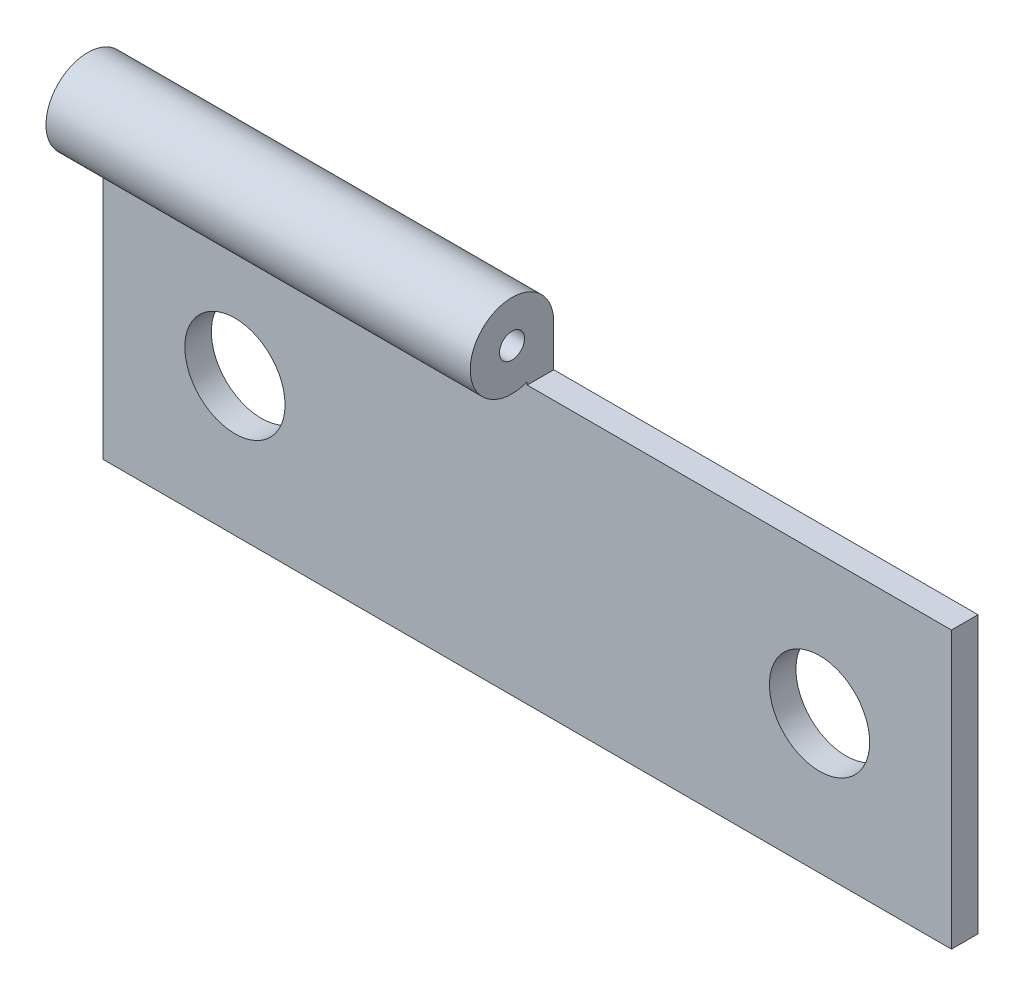
ISO-10303-21;
HEADER;
FILE_DESCRIPTION(('STEP AP214'),'2;1');
FILE_NAME('part.step','',(''),(''),'','','');
FILE_SCHEMA(('AUTOMOTIVE_DESIGN { 1 0 10303 214 1 1 1 1 }'));
ENDSEC;
DATA;
#1=APPLICATION_CONTEXT('core data for automotive mechanical design processes');
#2=APPLICATION_PROTOCOL_DEFINITION('international standard','automotive_design',2000,#1);
#3=PRODUCT_CONTEXT('',#1,'mechanical');
#4=PRODUCT('Part','Part','',(#3));
#5=PRODUCT_RELATED_PRODUCT_CATEGORY('part','',(#4));
#6=PRODUCT_DEFINITION_FORMATION('','',#4);
#7=PRODUCT_DEFINITION_CONTEXT('part definition',#1,'design');
#8=PRODUCT_DEFINITION('design','',#6,#7);
#9=PRODUCT_DEFINITION_SHAPE('','',#8);
#10=(LENGTH_UNIT() NAMED_UNIT(*) SI_UNIT(.MILLI.,.METRE.));
#11=(NAMED_UNIT(*) PLANE_ANGLE_UNIT() SI_UNIT($,.RADIAN.));
#12=(NAMED_UNIT(*) SI_UNIT($,.STERADIAN.) SOLID_ANGLE_UNIT());
#13=UNCERTAINTY_MEASURE_WITH_UNIT(LENGTH_MEASURE(1.E-05),#10,'distance_accuracy_value','');
#14=(GEOMETRIC_REPRESENTATION_CONTEXT(3) GLOBAL_UNCERTAINTY_ASSIGNED_CONTEXT((#13)) GLOBAL_UNIT_ASSIGNED_CONTEXT((#10,
#11,#12)) REPRESENTATION_CONTEXT('',''));
#15=CARTESIAN_POINT('',(0.,0.,0.));
#16=DIRECTION('',(0.,0.,1.));
#17=DIRECTION('',(1.,0.,0.));
#18=AXIS2_PLACEMENT_3D('',#15,#16,#17);
#19=CARTESIAN_POINT('',(0.,0.,1.5875));
#20=DIRECTION('',(0.,0.,1.));
#21=DIRECTION('',(1.,0.,0.));
#22=AXIS2_PLACEMENT_3D('',#19,#20,#21);
#23=PLANE('',#22);
#24=CARTESIAN_POINT('',(-17.5,8.275,1.5875));
#25=DIRECTION('',(0.,0.,1.));
#26=DIRECTION('',(1.,0.,0.));
#27=AXIS2_PLACEMENT_3D('',#24,#25,#26);
#28=CIRCLE('',#27,3.);
#29=CARTESIAN_POINT('',(-14.5,8.275,1.5875));
#30=VERTEX_POINT('',#29);
#31=EDGE_CURVE('E257',#30,#30,#28,.T.);
#32=ORIENTED_EDGE('',*,*,#31,.F.);
#33=EDGE_LOOP('',(#32));
#34=FACE_BOUND('',#33,.T.);
#35=CARTESIAN_POINT('',(17.5,8.275,1.5875));
#36=DIRECTION('',(0.,0.,1.));
#37=DIRECTION('',(1.,0.,0.));
#38=AXIS2_PLACEMENT_3D('',#35,#36,#37);
#39=CIRCLE('',#38,3.);
#40=CARTESIAN_POINT('',(20.5,8.275,1.5875));
#41=VERTEX_POINT('',#40);
#42=EDGE_CURVE('E261',#41,#41,#39,.T.);
#43=ORIENTED_EDGE('',*,*,#42,.F.);
#44=EDGE_LOOP('',(#43));
#45=FACE_BOUND('',#44,.T.);
#46=DIRECTION('',(-1.,0.,0.));
#47=VECTOR('',#46,1.);
#48=CARTESIAN_POINT('',(0.,16.55,1.5875));
#49=LINE('',#48,#47);
#50=CARTESIAN_POINT('',(25.4,16.55,1.5875));
#51=VERTEX_POINT('',#50);
#52=CARTESIAN_POINT('',(0.,16.55,1.5875));
#53=VERTEX_POINT('',#52);
#54=EDGE_CURVE('E111',#51,#53,#49,.T.);
#55=ORIENTED_EDGE('',*,*,#54,.T.);
#56=DIRECTION('',(0.,1.,0.));
#57=VECTOR('',#56,1.);
#58=CARTESIAN_POINT('',(0.,0.,1.5875));
#59=LINE('',#58,#57);
#60=CARTESIAN_POINT('',(0.,16.7224812030834,1.5875));
#61=VERTEX_POINT('',#60);
#62=EDGE_CURVE('E94',#53,#61,#59,.T.);
#63=ORIENTED_EDGE('',*,*,#62,.T.);
#64=DIRECTION('',(-1.,0.,0.));
#65=VECTOR('',#64,1.);
#66=CARTESIAN_POINT('',(0.,16.7224812030834,1.5875));
#67=LINE('',#66,#65);
#68=CARTESIAN_POINT('',(-25.4,16.7224812030834,1.5875));
#69=VERTEX_POINT('',#68);
#70=EDGE_CURVE('E56',#69,#61,#67,.F.);
#71=ORIENTED_EDGE('',*,*,#70,.F.);
#72=DIRECTION('',(0.,-1.,0.));
#73=VECTOR('',#72,1.);
#74=CARTESIAN_POINT('',(-25.4,0.,1.5875));
#75=LINE('',#74,#73);
#76=CARTESIAN_POINT('',(-25.4,0.,1.5875));
#77=VERTEX_POINT('',#76);
#78=EDGE_CURVE('E126',#69,#77,#75,.T.);
#79=ORIENTED_EDGE('',*,*,#78,.T.);
#80=DIRECTION('',(1.,0.,0.));
#81=VECTOR('',#80,1.);
#82=CARTESIAN_POINT('',(-25.4,0.,1.5875));
#83=LINE('',#82,#81);
#84=CARTESIAN_POINT('',(25.4,0.,1.5875));
#85=VERTEX_POINT('',#84);
#86=EDGE_CURVE('E128',#77,#85,#83,.T.);
#87=ORIENTED_EDGE('',*,*,#86,.T.);
#88=DIRECTION('',(0.,1.,0.));
#89=VECTOR('',#88,1.);
#90=CARTESIAN_POINT('',(25.4,0.,1.5875));
#91=LINE('',#90,#89);
#92=EDGE_CURVE('E130',#85,#51,#91,.T.);
#93=ORIENTED_EDGE('',*,*,#92,.T.);
#94=EDGE_LOOP('',(#55,#63,#71,#79,#87,#93));
#95=FACE_BOUND('',#94,.T.);
#96=ADVANCED_FACE('F33',(#34,#45,#95),#23,.T.);
#97=CARTESIAN_POINT('',(0.,0.,0.));
#98=DIRECTION('',(0.,0.,1.));
#99=DIRECTION('',(1.,0.,0.));
#100=AXIS2_PLACEMENT_3D('',#97,#98,#99);
#101=PLANE('',#100);
#102=CARTESIAN_POINT('',(-17.5,8.275,0.));
#103=DIRECTION('',(0.,0.,1.));
#104=DIRECTION('',(1.,0.,0.));
#105=AXIS2_PLACEMENT_3D('',#102,#103,#104);
#106=CIRCLE('',#105,2.99999999999999);
#107=CARTESIAN_POINT('',(-14.5,8.275,0.));
#108=VERTEX_POINT('',#107);
#109=EDGE_CURVE('E260',#108,#108,#106,.T.);
#110=ORIENTED_EDGE('',*,*,#109,.T.);
#111=EDGE_LOOP('',(#110));
#112=FACE_BOUND('',#111,.T.);
#113=CARTESIAN_POINT('',(17.5,8.275,0.));
#114=DIRECTION('',(0.,0.,1.));
#115=DIRECTION('',(1.,0.,0.));
#116=AXIS2_PLACEMENT_3D('',#113,#114,#115);
#117=CIRCLE('',#116,2.99999999999999);
#118=CARTESIAN_POINT('',(20.5,8.275,0.));
#119=VERTEX_POINT('',#118);
#120=EDGE_CURVE('E96',#119,#119,#117,.T.);
#121=ORIENTED_EDGE('',*,*,#120,.T.);
#122=EDGE_LOOP('',(#121));
#123=FACE_BOUND('',#122,.T.);
#124=DIRECTION('',(0.,1.,0.));
#125=VECTOR('',#124,1.);
#126=CARTESIAN_POINT('',(0.,16.55,0.));
#127=LINE('',#126,#125);
#128=CARTESIAN_POINT('',(0.,16.55,0.));
#129=VERTEX_POINT('',#128);
#130=CARTESIAN_POINT('',(0.,19.05,0.));
#131=VERTEX_POINT('',#130);
#132=EDGE_CURVE('E92',#129,#131,#127,.T.);
#133=ORIENTED_EDGE('',*,*,#132,.F.);
#134=DIRECTION('',(-1.,0.,0.));
#135=VECTOR('',#134,1.);
#136=CARTESIAN_POINT('',(32.4710678118655,16.55,0.));
#137=LINE('',#136,#135);
#138=CARTESIAN_POINT('',(25.4,16.55,0.));
#139=VERTEX_POINT('',#138);
#140=EDGE_CURVE('E98',#139,#129,#137,.T.);
#141=ORIENTED_EDGE('',*,*,#140,.F.);
#142=DIRECTION('',(0.,1.,0.));
#143=VECTOR('',#142,1.);
#144=CARTESIAN_POINT('',(25.4,0.,0.));
#145=LINE('',#144,#143);
#146=CARTESIAN_POINT('',(25.4,0.,0.));
#147=VERTEX_POINT('',#146);
#148=EDGE_CURVE('E137',#147,#139,#145,.T.);
#149=ORIENTED_EDGE('',*,*,#148,.F.);
#150=DIRECTION('',(1.,0.,0.));
#151=VECTOR('',#150,1.);
#152=CARTESIAN_POINT('',(-25.4,0.,0.));
#153=LINE('',#152,#151);
#154=CARTESIAN_POINT('',(-25.4,0.,0.));
#155=VERTEX_POINT('',#154);
#156=EDGE_CURVE('E135',#155,#147,#153,.T.);
#157=ORIENTED_EDGE('',*,*,#156,.F.);
#158=DIRECTION('',(0.,-1.,0.));
#159=VECTOR('',#158,1.);
#160=CARTESIAN_POINT('',(-25.4,0.,0.));
#161=LINE('',#160,#159);
#162=CARTESIAN_POINT('',(-25.4,19.05,0.));
#163=VERTEX_POINT('',#162);
#164=EDGE_CURVE('E125',#163,#155,#161,.T.);
#165=ORIENTED_EDGE('',*,*,#164,.F.);
#166=DIRECTION('',(-1.,0.,0.));
#167=VECTOR('',#166,1.);
#168=CARTESIAN_POINT('',(25.4,19.05,0.));
#169=LINE('',#168,#167);
#170=EDGE_CURVE('E106',#131,#163,#169,.T.);
#171=ORIENTED_EDGE('',*,*,#170,.F.);
#172=EDGE_LOOP('',(#133,#141,#149,#157,#165,#171));
#173=FACE_BOUND('',#172,.T.);
#174=ADVANCED_FACE('F104',(#112,#123,#173),#101,.F.);
#175=CARTESIAN_POINT('',(-25.4,0.,1.5875));
#176=DIRECTION('',(1.,0.,0.));
#177=DIRECTION('',(0.,0.,-1.));
#178=AXIS2_PLACEMENT_3D('',#175,#176,#177);
#179=PLANE('',#178);
#180=ORIENTED_EDGE('',*,*,#78,.F.);
#181=CARTESIAN_POINT('',(-25.4,19.05,2.5));
#182=DIRECTION('',(-1.,0.,0.));
#183=DIRECTION('',(0.,0.,1.));
#184=AXIS2_PLACEMENT_3D('',#181,#182,#183);
#185=CIRCLE('',#184,2.5);
#186=EDGE_CURVE('E117',#69,#163,#185,.T.);
#187=ORIENTED_EDGE('',*,*,#186,.T.);
#188=ORIENTED_EDGE('',*,*,#164,.T.);
#189=DIRECTION('',(0.,0.,-1.));
#190=VECTOR('',#189,1.);
#191=CARTESIAN_POINT('',(-25.4,0.,1.5875));
#192=LINE('',#191,#190);
#193=EDGE_CURVE('E11',#77,#155,#192,.T.);
#194=ORIENTED_EDGE('',*,*,#193,.F.);
#195=EDGE_LOOP('',(#180,#187,#188,#194));
#196=FACE_BOUND('',#195,.T.);
#197=CARTESIAN_POINT('',(-25.4,19.05,2.5));
#198=DIRECTION('',(-1.,0.,0.));
#199=DIRECTION('',(0.,0.,1.));
#200=AXIS2_PLACEMENT_3D('',#197,#198,#199);
#201=CIRCLE('',#200,0.750000000000003);
#202=CARTESIAN_POINT('',(-25.4,19.05,3.25));
#203=VERTEX_POINT('',#202);
#204=EDGE_CURVE('E113',#203,#203,#201,.T.);
#205=ORIENTED_EDGE('',*,*,#204,.F.);
#206=EDGE_LOOP('',(#205));
#207=FACE_BOUND('',#206,.T.);
#208=ADVANCED_FACE('F35',(#196,#207),#179,.F.);
#209=CARTESIAN_POINT('',(-25.4,0.,1.5875));
#210=DIRECTION('',(0.,1.,0.));
#211=DIRECTION('',(-1.,0.,0.));
#212=AXIS2_PLACEMENT_3D('',#209,#210,#211);
#213=PLANE('',#212);
#214=ORIENTED_EDGE('',*,*,#156,.T.);
#215=DIRECTION('',(0.,0.,-1.));
#216=VECTOR('',#215,1.);
#217=CARTESIAN_POINT('',(25.4,0.,1.5875));
#218=LINE('',#217,#216);
#219=EDGE_CURVE('E41',#85,#147,#218,.T.);
#220=ORIENTED_EDGE('',*,*,#219,.F.);
#221=ORIENTED_EDGE('',*,*,#86,.F.);
#222=ORIENTED_EDGE('',*,*,#193,.T.);
#223=EDGE_LOOP('',(#214,#220,#221,#222));
#224=FACE_BOUND('',#223,.T.);
#225=ADVANCED_FACE('F147',(#224),#213,.F.);
#226=CARTESIAN_POINT('',(25.4,0.,1.5875));
#227=DIRECTION('',(-1.,0.,0.));
#228=DIRECTION('',(0.,0.,1.));
#229=AXIS2_PLACEMENT_3D('',#226,#227,#228);
#230=PLANE('',#229);
#231=DIRECTION('',(0.,0.,1.));
#232=VECTOR('',#231,1.);
#233=CARTESIAN_POINT('',(25.4,16.55,2.5));
#234=LINE('',#233,#232);
#235=EDGE_CURVE('E48',#139,#51,#234,.T.);
#236=ORIENTED_EDGE('',*,*,#235,.T.);
#237=ORIENTED_EDGE('',*,*,#92,.F.);
#238=ORIENTED_EDGE('',*,*,#219,.T.);
#239=ORIENTED_EDGE('',*,*,#148,.T.);
#240=EDGE_LOOP('',(#236,#237,#238,#239));
#241=FACE_BOUND('',#240,.T.);
#242=ADVANCED_FACE('F143',(#241),#230,.F.);
#243=CARTESIAN_POINT('',(0.,19.05,2.5));
#244=DIRECTION('',(-1.,0.,0.));
#245=DIRECTION('',(0.,0.,1.));
#246=AXIS2_PLACEMENT_3D('',#243,#244,#245);
#247=PLANE('',#246);
#248=ORIENTED_EDGE('',*,*,#132,.T.);
#249=CARTESIAN_POINT('',(0.,19.05,2.5));
#250=DIRECTION('',(-1.,0.,0.));
#251=DIRECTION('',(0.,0.,1.));
#252=AXIS2_PLACEMENT_3D('',#249,#250,#251);
#253=CIRCLE('',#252,2.5);
#254=EDGE_CURVE('E120',#61,#131,#253,.T.);
#255=ORIENTED_EDGE('',*,*,#254,.F.);
#256=ORIENTED_EDGE('',*,*,#62,.F.);
#257=DIRECTION('',(0.,0.,-1.));
#258=VECTOR('',#257,1.);
#259=CARTESIAN_POINT('',(0.,16.55,2.5));
#260=LINE('',#259,#258);
#261=EDGE_CURVE('E87',#53,#129,#260,.T.);
#262=ORIENTED_EDGE('',*,*,#261,.T.);
#263=EDGE_LOOP('',(#248,#255,#256,#262));
#264=FACE_BOUND('',#263,.T.);
#265=CARTESIAN_POINT('',(0.,19.05,2.5));
#266=DIRECTION('',(-1.,0.,0.));
#267=DIRECTION('',(0.,0.,1.));
#268=AXIS2_PLACEMENT_3D('',#265,#266,#267);
#269=CIRCLE('',#268,0.750000000000003);
#270=CARTESIAN_POINT('',(0.,19.05,3.25));
#271=VERTEX_POINT('',#270);
#272=EDGE_CURVE('E114',#271,#271,#269,.T.);
#273=ORIENTED_EDGE('',*,*,#272,.T.);
#274=EDGE_LOOP('',(#273));
#275=FACE_BOUND('',#274,.T.);
#276=ADVANCED_FACE('F88',(#264,#275),#247,.F.);
#277=CARTESIAN_POINT('',(0.,19.05,2.5));
#278=DIRECTION('',(-1.,0.,0.));
#279=DIRECTION('',(0.,0.,1.));
#280=AXIS2_PLACEMENT_3D('',#277,#278,#279);
#281=CYLINDRICAL_SURFACE('',#280,2.5);
#282=ORIENTED_EDGE('',*,*,#186,.F.);
#283=ORIENTED_EDGE('',*,*,#70,.T.);
#284=ORIENTED_EDGE('',*,*,#254,.T.);
#285=ORIENTED_EDGE('',*,*,#170,.T.);
#286=EDGE_LOOP('',(#282,#283,#284,#285));
#287=FACE_BOUND('',#286,.T.);
#288=ADVANCED_FACE('F152',(#287),#281,.T.);
#289=CARTESIAN_POINT('',(0.,19.05,2.5));
#290=DIRECTION('',(-1.,0.,0.));
#291=DIRECTION('',(0.,0.,1.));
#292=AXIS2_PLACEMENT_3D('',#289,#290,#291);
#293=CYLINDRICAL_SURFACE('',#292,0.750000000000003);
#294=ORIENTED_EDGE('',*,*,#272,.F.);
#295=EDGE_LOOP('',(#294));
#296=FACE_BOUND('',#295,.T.);
#297=ORIENTED_EDGE('',*,*,#204,.T.);
#298=EDGE_LOOP('',(#297));
#299=FACE_BOUND('',#298,.T.);
#300=ADVANCED_FACE('F154',(#296,#299),#293,.F.);
#301=CARTESIAN_POINT('',(32.4710678118655,16.55,2.5));
#302=DIRECTION('',(0.,1.,0.));
#303=DIRECTION('',(0.,0.,1.));
#304=AXIS2_PLACEMENT_3D('',#301,#302,#303);
#305=PLANE('',#304);
#306=ORIENTED_EDGE('',*,*,#235,.F.);
#307=ORIENTED_EDGE('',*,*,#140,.T.);
#308=ORIENTED_EDGE('',*,*,#261,.F.);
#309=ORIENTED_EDGE('',*,*,#54,.F.);
#310=EDGE_LOOP('',(#306,#307,#308,#309));
#311=FACE_BOUND('',#310,.T.);
#312=ADVANCED_FACE('F99',(#311),#305,.T.);
#313=CARTESIAN_POINT('',(17.5,8.275,1.5875));
#314=DIRECTION('',(0.,0.,1.));
#315=DIRECTION('',(1.,0.,0.));
#316=AXIS2_PLACEMENT_3D('',#313,#314,#315);
#317=CYLINDRICAL_SURFACE('',#316,2.99999999999999);
#318=ORIENTED_EDGE('',*,*,#42,.T.);
#319=EDGE_LOOP('',(#318));
#320=FACE_BOUND('',#319,.T.);
#321=ORIENTED_EDGE('',*,*,#120,.F.);
#322=EDGE_LOOP('',(#321));
#323=FACE_BOUND('',#322,.T.);
#324=ADVANCED_FACE('F195',(#320,#323),#317,.F.);
#325=CARTESIAN_POINT('',(-17.5,8.275,1.5875));
#326=DIRECTION('',(0.,0.,1.));
#327=DIRECTION('',(1.,0.,0.));
#328=AXIS2_PLACEMENT_3D('',#325,#326,#327);
#329=CYLINDRICAL_SURFACE('',#328,2.99999999999999);
#330=ORIENTED_EDGE('',*,*,#31,.T.);
#331=EDGE_LOOP('',(#330));
#332=FACE_BOUND('',#331,.T.);
#333=ORIENTED_EDGE('',*,*,#109,.F.);
#334=EDGE_LOOP('',(#333));
#335=FACE_BOUND('',#334,.T.);
#336=ADVANCED_FACE('F200',(#332,#335),#329,.F.);
#337=CLOSED_SHELL('',(#96,#174,#208,#225,#242,#276,#288,#300,#312,#324,#336));
#338=MANIFOLD_SOLID_BREP('B2',#337);
#339=ADVANCED_BREP_SHAPE_REPRESENTATION('',(#18,#338),#14);
#340=SHAPE_DEFINITION_REPRESENTATION(#9,#339);
ENDSEC;
END-ISO-10303-21;
